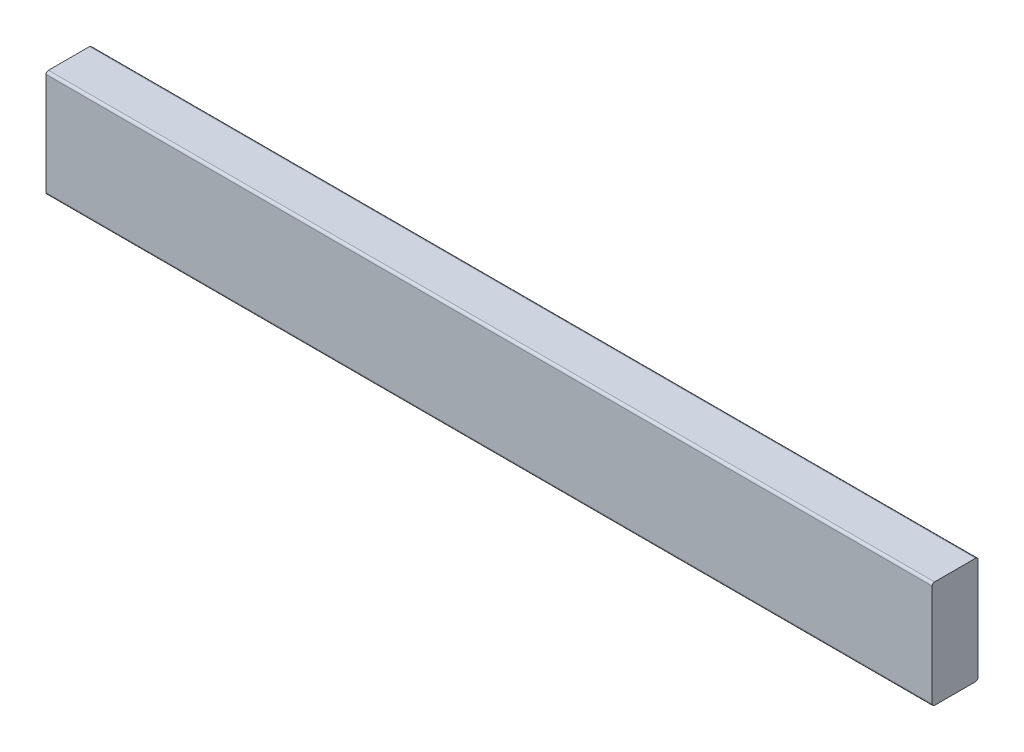
ISO-10303-21;
HEADER;
FILE_DESCRIPTION(('STEP AP214'),'2;1');
FILE_NAME('part.step','',(''),(''),'','','');
FILE_SCHEMA(('AUTOMOTIVE_DESIGN { 1 0 10303 214 1 1 1 1 }'));
ENDSEC;
DATA;
#1=APPLICATION_CONTEXT('core data for automotive mechanical design processes');
#2=APPLICATION_PROTOCOL_DEFINITION('international standard','automotive_design',2000,#1);
#3=PRODUCT_CONTEXT('',#1,'mechanical');
#4=PRODUCT('Part','Part','',(#3));
#5=PRODUCT_RELATED_PRODUCT_CATEGORY('part','',(#4));
#6=PRODUCT_DEFINITION_FORMATION('','',#4);
#7=PRODUCT_DEFINITION_CONTEXT('part definition',#1,'design');
#8=PRODUCT_DEFINITION('design','',#6,#7);
#9=PRODUCT_DEFINITION_SHAPE('','',#8);
#10=(LENGTH_UNIT() NAMED_UNIT(*) SI_UNIT(.MILLI.,.METRE.));
#11=(NAMED_UNIT(*) PLANE_ANGLE_UNIT() SI_UNIT($,.RADIAN.));
#12=(NAMED_UNIT(*) SI_UNIT($,.STERADIAN.) SOLID_ANGLE_UNIT());
#13=UNCERTAINTY_MEASURE_WITH_UNIT(LENGTH_MEASURE(1.E-05),#10,'distance_accuracy_value','');
#14=(GEOMETRIC_REPRESENTATION_CONTEXT(3) GLOBAL_UNCERTAINTY_ASSIGNED_CONTEXT((#13)) GLOBAL_UNIT_ASSIGNED_CONTEXT((#10,
#11,#12)) REPRESENTATION_CONTEXT('',''));
#15=CARTESIAN_POINT('',(0.,0.,0.));
#16=DIRECTION('',(0.,0.,1.));
#17=DIRECTION('',(1.,0.,0.));
#18=AXIS2_PLACEMENT_3D('',#15,#16,#17);
#19=CARTESIAN_POINT('',(736.6,-44.45,19.05));
#20=DIRECTION('',(0.,1.,0.));
#21=DIRECTION('',(0.,0.,1.));
#22=AXIS2_PLACEMENT_3D('',#19,#20,#21);
#23=PLANE('',#22);
#24=DIRECTION('',(0.,0.,-1.));
#25=VECTOR('',#24,1.);
#26=CARTESIAN_POINT('',(0.,-44.45,19.05));
#27=LINE('',#26,#25);
#28=CARTESIAN_POINT('',(0.,-44.45,17.05));
#29=VERTEX_POINT('',#28);
#30=CARTESIAN_POINT('',(0.,-44.45,-17.05));
#31=VERTEX_POINT('',#30);
#32=EDGE_CURVE('E127',#29,#31,#27,.T.);
#33=ORIENTED_EDGE('',*,*,#32,.T.);
#34=DIRECTION('',(-1.,0.,0.));
#35=VECTOR('',#34,1.);
#36=CARTESIAN_POINT('',(736.6,-44.45,-17.05));
#37=LINE('',#36,#35);
#38=CARTESIAN_POINT('',(736.6,-44.45,-17.05));
#39=VERTEX_POINT('',#38);
#40=EDGE_CURVE('E150',#31,#39,#37,.F.);
#41=ORIENTED_EDGE('',*,*,#40,.T.);
#42=DIRECTION('',(0.,0.,-1.));
#43=VECTOR('',#42,1.);
#44=CARTESIAN_POINT('',(736.6,-44.45,19.05));
#45=LINE('',#44,#43);
#46=CARTESIAN_POINT('',(736.6,-44.45,17.05));
#47=VERTEX_POINT('',#46);
#48=EDGE_CURVE('E125',#47,#39,#45,.T.);
#49=ORIENTED_EDGE('',*,*,#48,.F.);
#50=DIRECTION('',(-1.,0.,0.));
#51=VECTOR('',#50,1.);
#52=CARTESIAN_POINT('',(736.6,-44.45,17.05));
#53=LINE('',#52,#51);
#54=EDGE_CURVE('E147',#47,#29,#53,.T.);
#55=ORIENTED_EDGE('',*,*,#54,.T.);
#56=EDGE_LOOP('',(#33,#41,#49,#55));
#57=FACE_BOUND('',#56,.T.);
#58=ADVANCED_FACE('F32',(#57),#23,.F.);
#59=CARTESIAN_POINT('',(736.6,44.45,-19.05));
#60=DIRECTION('',(0.,0.,1.));
#61=DIRECTION('',(1.,0.,0.));
#62=AXIS2_PLACEMENT_3D('',#59,#60,#61);
#63=PLANE('',#62);
#64=DIRECTION('',(0.,1.,0.));
#65=VECTOR('',#64,1.);
#66=CARTESIAN_POINT('',(0.,44.45,-19.05));
#67=LINE('',#66,#65);
#68=CARTESIAN_POINT('',(0.,-42.45,-19.05));
#69=VERTEX_POINT('',#68);
#70=CARTESIAN_POINT('',(0.,42.45,-19.05));
#71=VERTEX_POINT('',#70);
#72=EDGE_CURVE('E123',#69,#71,#67,.T.);
#73=ORIENTED_EDGE('',*,*,#72,.T.);
#74=DIRECTION('',(-1.,0.,0.));
#75=VECTOR('',#74,1.);
#76=CARTESIAN_POINT('',(736.6,42.45,-19.05));
#77=LINE('',#76,#75);
#78=CARTESIAN_POINT('',(736.6,42.45,-19.05));
#79=VERTEX_POINT('',#78);
#80=EDGE_CURVE('E102',#71,#79,#77,.F.);
#81=ORIENTED_EDGE('',*,*,#80,.T.);
#82=DIRECTION('',(0.,1.,0.));
#83=VECTOR('',#82,1.);
#84=CARTESIAN_POINT('',(736.6,44.45,-19.05));
#85=LINE('',#84,#83);
#86=CARTESIAN_POINT('',(736.6,-42.45,-19.05));
#87=VERTEX_POINT('',#86);
#88=EDGE_CURVE('E166',#87,#79,#85,.T.);
#89=ORIENTED_EDGE('',*,*,#88,.F.);
#90=DIRECTION('',(-1.,0.,0.));
#91=VECTOR('',#90,1.);
#92=CARTESIAN_POINT('',(736.6,-42.45,-19.05));
#93=LINE('',#92,#91);
#94=EDGE_CURVE('E107',#87,#69,#93,.T.);
#95=ORIENTED_EDGE('',*,*,#94,.T.);
#96=EDGE_LOOP('',(#73,#81,#89,#95));
#97=FACE_BOUND('',#96,.T.);
#98=ADVANCED_FACE('F183',(#97),#63,.F.);
#99=CARTESIAN_POINT('',(736.6,44.45,19.05));
#100=DIRECTION('',(0.,-1.,0.));
#101=DIRECTION('',(0.,0.,-1.));
#102=AXIS2_PLACEMENT_3D('',#99,#100,#101);
#103=PLANE('',#102);
#104=DIRECTION('',(0.,0.,1.));
#105=VECTOR('',#104,1.);
#106=CARTESIAN_POINT('',(736.6,44.45,19.05));
#107=LINE('',#106,#105);
#108=CARTESIAN_POINT('',(736.6,44.45,-17.05));
#109=VERTEX_POINT('',#108);
#110=CARTESIAN_POINT('',(736.6,44.45,17.05));
#111=VERTEX_POINT('',#110);
#112=EDGE_CURVE('E116',#109,#111,#107,.T.);
#113=ORIENTED_EDGE('',*,*,#112,.F.);
#114=DIRECTION('',(-1.,0.,0.));
#115=VECTOR('',#114,1.);
#116=CARTESIAN_POINT('',(736.6,44.45,-17.05));
#117=LINE('',#116,#115);
#118=CARTESIAN_POINT('',(0.,44.45,-17.05));
#119=VERTEX_POINT('',#118);
#120=EDGE_CURVE('E101',#109,#119,#117,.T.);
#121=ORIENTED_EDGE('',*,*,#120,.T.);
#122=DIRECTION('',(0.,0.,1.));
#123=VECTOR('',#122,1.);
#124=CARTESIAN_POINT('',(0.,44.45,19.05));
#125=LINE('',#124,#123);
#126=CARTESIAN_POINT('',(0.,44.45,17.05));
#127=VERTEX_POINT('',#126);
#128=EDGE_CURVE('E114',#119,#127,#125,.T.);
#129=ORIENTED_EDGE('',*,*,#128,.T.);
#130=DIRECTION('',(-1.,0.,0.));
#131=VECTOR('',#130,1.);
#132=CARTESIAN_POINT('',(736.6,44.45,17.05));
#133=LINE('',#132,#131);
#134=EDGE_CURVE('E118',#127,#111,#133,.F.);
#135=ORIENTED_EDGE('',*,*,#134,.T.);
#136=EDGE_LOOP('',(#113,#121,#129,#135));
#137=FACE_BOUND('',#136,.T.);
#138=ADVANCED_FACE('F113',(#137),#103,.F.);
#139=CARTESIAN_POINT('',(736.6,44.45,19.05));
#140=DIRECTION('',(0.,0.,-1.));
#141=DIRECTION('',(-1.,0.,0.));
#142=AXIS2_PLACEMENT_3D('',#139,#140,#141);
#143=PLANE('',#142);
#144=DIRECTION('',(0.,-1.,0.));
#145=VECTOR('',#144,1.);
#146=CARTESIAN_POINT('',(0.,44.45,19.05));
#147=LINE('',#146,#145);
#148=CARTESIAN_POINT('',(0.,42.45,19.05));
#149=VERTEX_POINT('',#148);
#150=CARTESIAN_POINT('',(0.,-42.45,19.05));
#151=VERTEX_POINT('',#150);
#152=EDGE_CURVE('E122',#149,#151,#147,.T.);
#153=ORIENTED_EDGE('',*,*,#152,.T.);
#154=DIRECTION('',(-1.,0.,0.));
#155=VECTOR('',#154,1.);
#156=CARTESIAN_POINT('',(736.6,-42.45,19.05));
#157=LINE('',#156,#155);
#158=CARTESIAN_POINT('',(736.6,-42.45,19.05));
#159=VERTEX_POINT('',#158);
#160=EDGE_CURVE('E11',#151,#159,#157,.F.);
#161=ORIENTED_EDGE('',*,*,#160,.T.);
#162=DIRECTION('',(0.,-1.,0.));
#163=VECTOR('',#162,1.);
#164=CARTESIAN_POINT('',(736.6,44.45,19.05));
#165=LINE('',#164,#163);
#166=CARTESIAN_POINT('',(736.6,42.45,19.05));
#167=VERTEX_POINT('',#166);
#168=EDGE_CURVE('E131',#167,#159,#165,.T.);
#169=ORIENTED_EDGE('',*,*,#168,.F.);
#170=DIRECTION('',(-1.,0.,0.));
#171=VECTOR('',#170,1.);
#172=CARTESIAN_POINT('',(736.6,42.45,19.05));
#173=LINE('',#172,#171);
#174=EDGE_CURVE('E40',#167,#149,#173,.T.);
#175=ORIENTED_EDGE('',*,*,#174,.T.);
#176=EDGE_LOOP('',(#153,#161,#169,#175));
#177=FACE_BOUND('',#176,.T.);
#178=ADVANCED_FACE('F153',(#177),#143,.F.);
#179=CARTESIAN_POINT('',(736.6,0.,0.));
#180=DIRECTION('',(-1.,0.,0.));
#181=DIRECTION('',(0.,0.,1.));
#182=AXIS2_PLACEMENT_3D('',#179,#180,#181);
#183=PLANE('',#182);
#184=ORIENTED_EDGE('',*,*,#88,.T.);
#185=CARTESIAN_POINT('',(736.6,42.45,-17.05));
#186=DIRECTION('',(-1.,0.,0.));
#187=DIRECTION('',(0.,0.,1.));
#188=AXIS2_PLACEMENT_3D('',#185,#186,#187);
#189=CIRCLE('',#188,2.);
#190=EDGE_CURVE('E145',#79,#109,#189,.F.);
#191=ORIENTED_EDGE('',*,*,#190,.T.);
#192=ORIENTED_EDGE('',*,*,#112,.T.);
#193=CARTESIAN_POINT('',(736.6,42.45,17.05));
#194=DIRECTION('',(-1.,0.,0.));
#195=DIRECTION('',(0.,0.,1.));
#196=AXIS2_PLACEMENT_3D('',#193,#194,#195);
#197=CIRCLE('',#196,2.);
#198=EDGE_CURVE('E52',#111,#167,#197,.F.);
#199=ORIENTED_EDGE('',*,*,#198,.T.);
#200=ORIENTED_EDGE('',*,*,#168,.T.);
#201=CARTESIAN_POINT('',(736.6,-42.45,17.05));
#202=DIRECTION('',(-1.,0.,0.));
#203=DIRECTION('',(0.,0.,1.));
#204=AXIS2_PLACEMENT_3D('',#201,#202,#203);
#205=CIRCLE('',#204,2.);
#206=EDGE_CURVE('E141',#159,#47,#205,.F.);
#207=ORIENTED_EDGE('',*,*,#206,.T.);
#208=ORIENTED_EDGE('',*,*,#48,.T.);
#209=CARTESIAN_POINT('',(736.6,-42.45,-17.05));
#210=DIRECTION('',(-1.,0.,0.));
#211=DIRECTION('',(0.,0.,1.));
#212=AXIS2_PLACEMENT_3D('',#209,#210,#211);
#213=CIRCLE('',#212,2.);
#214=EDGE_CURVE('E143',#39,#87,#213,.F.);
#215=ORIENTED_EDGE('',*,*,#214,.T.);
#216=EDGE_LOOP('',(#184,#191,#192,#199,#200,#207,#208,#215));
#217=FACE_BOUND('',#216,.T.);
#218=ADVANCED_FACE('F172',(#217),#183,.F.);
#219=CARTESIAN_POINT('',(0.,0.,0.));
#220=DIRECTION('',(-1.,0.,0.));
#221=DIRECTION('',(0.,0.,1.));
#222=AXIS2_PLACEMENT_3D('',#219,#220,#221);
#223=PLANE('',#222);
#224=ORIENTED_EDGE('',*,*,#128,.F.);
#225=CARTESIAN_POINT('',(0.,42.45,-17.05));
#226=DIRECTION('',(-1.,0.,0.));
#227=DIRECTION('',(0.,0.,1.));
#228=AXIS2_PLACEMENT_3D('',#225,#226,#227);
#229=CIRCLE('',#228,2.);
#230=EDGE_CURVE('E97',#119,#71,#229,.T.);
#231=ORIENTED_EDGE('',*,*,#230,.T.);
#232=ORIENTED_EDGE('',*,*,#72,.F.);
#233=CARTESIAN_POINT('',(0.,-42.45,-17.05));
#234=DIRECTION('',(-1.,0.,0.));
#235=DIRECTION('',(0.,0.,1.));
#236=AXIS2_PLACEMENT_3D('',#233,#234,#235);
#237=CIRCLE('',#236,2.);
#238=EDGE_CURVE('E108',#69,#31,#237,.T.);
#239=ORIENTED_EDGE('',*,*,#238,.T.);
#240=ORIENTED_EDGE('',*,*,#32,.F.);
#241=CARTESIAN_POINT('',(0.,-42.45,17.05));
#242=DIRECTION('',(-1.,0.,0.));
#243=DIRECTION('',(0.,0.,1.));
#244=AXIS2_PLACEMENT_3D('',#241,#242,#243);
#245=CIRCLE('',#244,2.);
#246=EDGE_CURVE('E134',#29,#151,#245,.T.);
#247=ORIENTED_EDGE('',*,*,#246,.T.);
#248=ORIENTED_EDGE('',*,*,#152,.F.);
#249=CARTESIAN_POINT('',(0.,42.45,17.05));
#250=DIRECTION('',(-1.,0.,0.));
#251=DIRECTION('',(0.,0.,1.));
#252=AXIS2_PLACEMENT_3D('',#249,#250,#251);
#253=CIRCLE('',#252,2.);
#254=EDGE_CURVE('E117',#149,#127,#253,.T.);
#255=ORIENTED_EDGE('',*,*,#254,.T.);
#256=EDGE_LOOP('',(#224,#231,#232,#239,#240,#247,#248,#255));
#257=FACE_BOUND('',#256,.T.);
#258=ADVANCED_FACE('F120',(#257),#223,.T.);
#259=CARTESIAN_POINT('',(736.6,42.45,-17.05));
#260=DIRECTION('',(-1.,0.,0.));
#261=DIRECTION('',(0.,0.,1.));
#262=AXIS2_PLACEMENT_3D('',#259,#260,#261);
#263=CYLINDRICAL_SURFACE('',#262,2.);
#264=ORIENTED_EDGE('',*,*,#190,.F.);
#265=ORIENTED_EDGE('',*,*,#80,.F.);
#266=ORIENTED_EDGE('',*,*,#230,.F.);
#267=ORIENTED_EDGE('',*,*,#120,.F.);
#268=EDGE_LOOP('',(#264,#265,#266,#267));
#269=FACE_BOUND('',#268,.T.);
#270=ADVANCED_FACE('F100',(#269),#263,.T.);
#271=CARTESIAN_POINT('',(736.6,-42.45,-17.05));
#272=DIRECTION('',(-1.,0.,0.));
#273=DIRECTION('',(0.,0.,1.));
#274=AXIS2_PLACEMENT_3D('',#271,#272,#273);
#275=CYLINDRICAL_SURFACE('',#274,2.);
#276=ORIENTED_EDGE('',*,*,#214,.F.);
#277=ORIENTED_EDGE('',*,*,#40,.F.);
#278=ORIENTED_EDGE('',*,*,#238,.F.);
#279=ORIENTED_EDGE('',*,*,#94,.F.);
#280=EDGE_LOOP('',(#276,#277,#278,#279));
#281=FACE_BOUND('',#280,.T.);
#282=ADVANCED_FACE('F194',(#281),#275,.T.);
#283=CARTESIAN_POINT('',(736.6,-42.45,17.05));
#284=DIRECTION('',(-1.,0.,0.));
#285=DIRECTION('',(0.,0.,1.));
#286=AXIS2_PLACEMENT_3D('',#283,#284,#285);
#287=CYLINDRICAL_SURFACE('',#286,2.);
#288=ORIENTED_EDGE('',*,*,#206,.F.);
#289=ORIENTED_EDGE('',*,*,#160,.F.);
#290=ORIENTED_EDGE('',*,*,#246,.F.);
#291=ORIENTED_EDGE('',*,*,#54,.F.);
#292=EDGE_LOOP('',(#288,#289,#290,#291));
#293=FACE_BOUND('',#292,.T.);
#294=ADVANCED_FACE('F160',(#293),#287,.T.);
#295=CARTESIAN_POINT('',(736.6,42.45,17.05));
#296=DIRECTION('',(-1.,0.,0.));
#297=DIRECTION('',(0.,0.,1.));
#298=AXIS2_PLACEMENT_3D('',#295,#296,#297);
#299=CYLINDRICAL_SURFACE('',#298,2.);
#300=ORIENTED_EDGE('',*,*,#198,.F.);
#301=ORIENTED_EDGE('',*,*,#134,.F.);
#302=ORIENTED_EDGE('',*,*,#254,.F.);
#303=ORIENTED_EDGE('',*,*,#174,.F.);
#304=EDGE_LOOP('',(#300,#301,#302,#303));
#305=FACE_BOUND('',#304,.T.);
#306=ADVANCED_FACE('F34',(#305),#299,.T.);
#307=CLOSED_SHELL('',(#58,#98,#138,#178,#218,#258,#270,#282,#294,#306));
#308=MANIFOLD_SOLID_BREP('B2',#307);
#309=ADVANCED_BREP_SHAPE_REPRESENTATION('',(#18,#308),#14);
#310=SHAPE_DEFINITION_REPRESENTATION(#9,#309);
ENDSEC;
END-ISO-10303-21;
